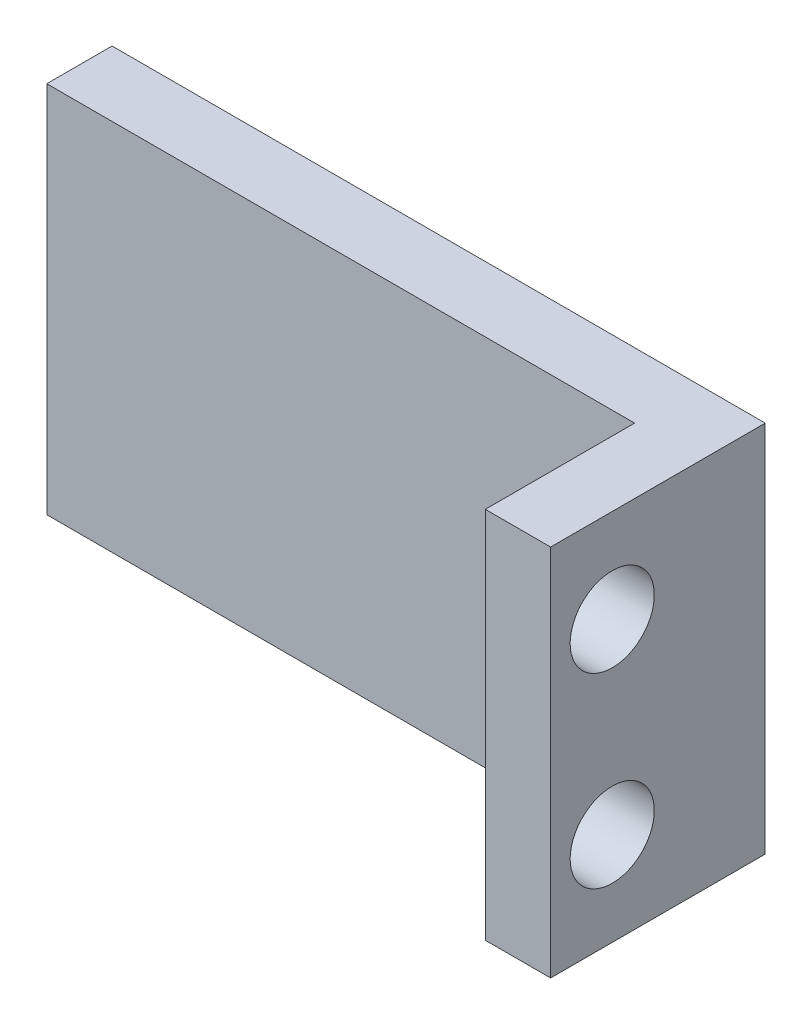
ISO-10303-21;
HEADER;
FILE_DESCRIPTION(('STEP AP214'),'2;1');
FILE_NAME('part.step','',(''),(''),'','','');
FILE_SCHEMA(('AUTOMOTIVE_DESIGN { 1 0 10303 214 1 1 1 1 }'));
ENDSEC;
DATA;
#1=APPLICATION_CONTEXT('core data for automotive mechanical design processes');
#2=APPLICATION_PROTOCOL_DEFINITION('international standard','automotive_design',2000,#1);
#3=PRODUCT_CONTEXT('',#1,'mechanical');
#4=PRODUCT('Part','Part','',(#3));
#5=PRODUCT_RELATED_PRODUCT_CATEGORY('part','',(#4));
#6=PRODUCT_DEFINITION_FORMATION('','',#4);
#7=PRODUCT_DEFINITION_CONTEXT('part definition',#1,'design');
#8=PRODUCT_DEFINITION('design','',#6,#7);
#9=PRODUCT_DEFINITION_SHAPE('','',#8);
#10=(LENGTH_UNIT() NAMED_UNIT(*) SI_UNIT(.MILLI.,.METRE.));
#11=(NAMED_UNIT(*) PLANE_ANGLE_UNIT() SI_UNIT($,.RADIAN.));
#12=(NAMED_UNIT(*) SI_UNIT($,.STERADIAN.) SOLID_ANGLE_UNIT());
#13=UNCERTAINTY_MEASURE_WITH_UNIT(LENGTH_MEASURE(1.E-05),#10,'distance_accuracy_value','');
#14=(GEOMETRIC_REPRESENTATION_CONTEXT(3) GLOBAL_UNCERTAINTY_ASSIGNED_CONTEXT((#13)) GLOBAL_UNIT_ASSIGNED_CONTEXT((#10,
#11,#12)) REPRESENTATION_CONTEXT('',''));
#15=CARTESIAN_POINT('',(0.,0.,0.));
#16=DIRECTION('',(0.,0.,1.));
#17=DIRECTION('',(1.,0.,0.));
#18=AXIS2_PLACEMENT_3D('',#15,#16,#17);
#19=CARTESIAN_POINT('',(-17.5,-10.,3.5));
#20=DIRECTION('',(1.,0.,0.));
#21=DIRECTION('',(0.,0.,-1.));
#22=AXIS2_PLACEMENT_3D('',#19,#20,#21);
#23=PLANE('',#22);
#24=DIRECTION('',(0.,-1.,0.));
#25=VECTOR('',#24,1.);
#26=CARTESIAN_POINT('',(-17.5,-10.,0.));
#27=LINE('',#26,#25);
#28=CARTESIAN_POINT('',(-17.5,10.,0.));
#29=VERTEX_POINT('',#28);
#30=CARTESIAN_POINT('',(-17.5,-10.,0.));
#31=VERTEX_POINT('',#30);
#32=EDGE_CURVE('E101',#29,#31,#27,.T.);
#33=ORIENTED_EDGE('',*,*,#32,.T.);
#34=DIRECTION('',(0.,0.,-1.));
#35=VECTOR('',#34,1.);
#36=CARTESIAN_POINT('',(-17.5,-10.,3.5));
#37=LINE('',#36,#35);
#38=CARTESIAN_POINT('',(-17.5,-10.,3.5));
#39=VERTEX_POINT('',#38);
#40=EDGE_CURVE('E11',#39,#31,#37,.T.);
#41=ORIENTED_EDGE('',*,*,#40,.F.);
#42=DIRECTION('',(0.,-1.,0.));
#43=VECTOR('',#42,1.);
#44=CARTESIAN_POINT('',(-17.5,-10.,3.5));
#45=LINE('',#44,#43);
#46=CARTESIAN_POINT('',(-17.5,10.,3.5));
#47=VERTEX_POINT('',#46);
#48=EDGE_CURVE('E95',#47,#39,#45,.T.);
#49=ORIENTED_EDGE('',*,*,#48,.F.);
#50=DIRECTION('',(0.,0.,-1.));
#51=VECTOR('',#50,1.);
#52=CARTESIAN_POINT('',(-17.5,10.,3.5));
#53=LINE('',#52,#51);
#54=EDGE_CURVE('E86',#47,#29,#53,.T.);
#55=ORIENTED_EDGE('',*,*,#54,.T.);
#56=EDGE_LOOP('',(#33,#41,#49,#55));
#57=FACE_BOUND('',#56,.T.);
#58=ADVANCED_FACE('F43',(#57),#23,.F.);
#59=CARTESIAN_POINT('',(17.5,-10.,3.5));
#60=DIRECTION('',(0.,1.,0.));
#61=DIRECTION('',(-1.,0.,0.));
#62=AXIS2_PLACEMENT_3D('',#59,#60,#61);
#63=PLANE('',#62);
#64=DIRECTION('',(1.,0.,0.));
#65=VECTOR('',#64,1.);
#66=CARTESIAN_POINT('',(17.5,-10.,0.));
#67=LINE('',#66,#65);
#68=CARTESIAN_POINT('',(17.5,-10.,0.));
#69=VERTEX_POINT('',#68);
#70=EDGE_CURVE('E105',#31,#69,#67,.T.);
#71=ORIENTED_EDGE('',*,*,#70,.T.);
#72=DIRECTION('',(0.,0.,-1.));
#73=VECTOR('',#72,1.);
#74=CARTESIAN_POINT('',(17.5,-10.,3.5));
#75=LINE('',#74,#73);
#76=CARTESIAN_POINT('',(17.5,-10.,11.5));
#77=VERTEX_POINT('',#76);
#78=EDGE_CURVE('E51',#77,#69,#75,.T.);
#79=ORIENTED_EDGE('',*,*,#78,.F.);
#80=DIRECTION('',(1.,0.,0.));
#81=VECTOR('',#80,1.);
#82=CARTESIAN_POINT('',(17.5,-10.,11.5));
#83=LINE('',#82,#81);
#84=CARTESIAN_POINT('',(14.,-10.,11.5));
#85=VERTEX_POINT('',#84);
#86=EDGE_CURVE('E135',#85,#77,#83,.T.);
#87=ORIENTED_EDGE('',*,*,#86,.F.);
#88=DIRECTION('',(0.,0.,-1.));
#89=VECTOR('',#88,1.);
#90=CARTESIAN_POINT('',(14.,-10.,11.5));
#91=LINE('',#90,#89);
#92=CARTESIAN_POINT('',(14.,-10.,3.5));
#93=VERTEX_POINT('',#92);
#94=EDGE_CURVE('E113',#85,#93,#91,.T.);
#95=ORIENTED_EDGE('',*,*,#94,.T.);
#96=DIRECTION('',(1.,0.,0.));
#97=VECTOR('',#96,1.);
#98=CARTESIAN_POINT('',(17.5,-10.,3.5));
#99=LINE('',#98,#97);
#100=EDGE_CURVE('E158',#39,#93,#99,.T.);
#101=ORIENTED_EDGE('',*,*,#100,.F.);
#102=ORIENTED_EDGE('',*,*,#40,.T.);
#103=EDGE_LOOP('',(#71,#79,#87,#95,#101,#102));
#104=FACE_BOUND('',#103,.T.);
#105=ADVANCED_FACE('F132',(#104),#63,.F.);
#106=CARTESIAN_POINT('',(17.5,-10.,3.5));
#107=DIRECTION('',(-1.,0.,0.));
#108=DIRECTION('',(0.,0.,1.));
#109=AXIS2_PLACEMENT_3D('',#106,#107,#108);
#110=PLANE('',#109);
#111=CARTESIAN_POINT('',(17.5,5.,8.2));
#112=DIRECTION('',(-1.,0.,0.));
#113=DIRECTION('',(0.,0.,1.));
#114=AXIS2_PLACEMENT_3D('',#111,#112,#113);
#115=CIRCLE('',#114,2.255);
#116=CARTESIAN_POINT('',(17.5,5.,10.455));
#117=VERTEX_POINT('',#116);
#118=EDGE_CURVE('E155',#117,#117,#115,.T.);
#119=ORIENTED_EDGE('',*,*,#118,.T.);
#120=EDGE_LOOP('',(#119));
#121=FACE_BOUND('',#120,.T.);
#122=CARTESIAN_POINT('',(17.5,-5.,8.19999999999999));
#123=DIRECTION('',(-1.,0.,0.));
#124=DIRECTION('',(0.,0.,1.));
#125=AXIS2_PLACEMENT_3D('',#122,#123,#124);
#126=CIRCLE('',#125,2.255);
#127=CARTESIAN_POINT('',(17.5,-5.,10.455));
#128=VERTEX_POINT('',#127);
#129=EDGE_CURVE('E177',#128,#128,#126,.T.);
#130=ORIENTED_EDGE('',*,*,#129,.T.);
#131=EDGE_LOOP('',(#130));
#132=FACE_BOUND('',#131,.T.);
#133=DIRECTION('',(0.,1.,0.));
#134=VECTOR('',#133,1.);
#135=CARTESIAN_POINT('',(17.5,-10.,0.));
#136=LINE('',#135,#134);
#137=CARTESIAN_POINT('',(17.5,10.,0.));
#138=VERTEX_POINT('',#137);
#139=EDGE_CURVE('E96',#69,#138,#136,.T.);
#140=ORIENTED_EDGE('',*,*,#139,.T.);
#141=DIRECTION('',(0.,0.,-1.));
#142=VECTOR('',#141,1.);
#143=CARTESIAN_POINT('',(17.5,10.,3.5));
#144=LINE('',#143,#142);
#145=CARTESIAN_POINT('',(17.5,10.,11.5));
#146=VERTEX_POINT('',#145);
#147=EDGE_CURVE('E90',#146,#138,#144,.T.);
#148=ORIENTED_EDGE('',*,*,#147,.F.);
#149=DIRECTION('',(0.,1.,0.));
#150=VECTOR('',#149,1.);
#151=CARTESIAN_POINT('',(17.5,-10.,11.5));
#152=LINE('',#151,#150);
#153=EDGE_CURVE('E128',#77,#146,#152,.T.);
#154=ORIENTED_EDGE('',*,*,#153,.F.);
#155=ORIENTED_EDGE('',*,*,#78,.T.);
#156=EDGE_LOOP('',(#140,#148,#154,#155));
#157=FACE_BOUND('',#156,.T.);
#158=ADVANCED_FACE('F126',(#121,#132,#157),#110,.F.);
#159=CARTESIAN_POINT('',(17.5,10.,3.5));
#160=DIRECTION('',(0.,-1.,0.));
#161=DIRECTION('',(1.,0.,0.));
#162=AXIS2_PLACEMENT_3D('',#159,#160,#161);
#163=PLANE('',#162);
#164=DIRECTION('',(-1.,0.,0.));
#165=VECTOR('',#164,1.);
#166=CARTESIAN_POINT('',(17.5,10.,0.));
#167=LINE('',#166,#165);
#168=EDGE_CURVE('E83',#138,#29,#167,.T.);
#169=ORIENTED_EDGE('',*,*,#168,.T.);
#170=ORIENTED_EDGE('',*,*,#54,.F.);
#171=DIRECTION('',(-1.,0.,0.));
#172=VECTOR('',#171,1.);
#173=CARTESIAN_POINT('',(17.5,10.,3.5));
#174=LINE('',#173,#172);
#175=CARTESIAN_POINT('',(14.,10.,3.5));
#176=VERTEX_POINT('',#175);
#177=EDGE_CURVE('E63',#176,#47,#174,.T.);
#178=ORIENTED_EDGE('',*,*,#177,.F.);
#179=DIRECTION('',(0.,0.,-1.));
#180=VECTOR('',#179,1.);
#181=CARTESIAN_POINT('',(14.,10.,11.5));
#182=LINE('',#181,#180);
#183=CARTESIAN_POINT('',(14.,10.,11.5));
#184=VERTEX_POINT('',#183);
#185=EDGE_CURVE('E107',#184,#176,#182,.T.);
#186=ORIENTED_EDGE('',*,*,#185,.F.);
#187=DIRECTION('',(-1.,0.,0.));
#188=VECTOR('',#187,1.);
#189=CARTESIAN_POINT('',(17.5,10.,11.5));
#190=LINE('',#189,#188);
#191=EDGE_CURVE('E150',#146,#184,#190,.T.);
#192=ORIENTED_EDGE('',*,*,#191,.F.);
#193=ORIENTED_EDGE('',*,*,#147,.T.);
#194=EDGE_LOOP('',(#169,#170,#178,#186,#192,#193));
#195=FACE_BOUND('',#194,.T.);
#196=ADVANCED_FACE('F85',(#195),#163,.F.);
#197=CARTESIAN_POINT('',(0.,0.,3.5));
#198=DIRECTION('',(0.,0.,1.));
#199=DIRECTION('',(1.,0.,0.));
#200=AXIS2_PLACEMENT_3D('',#197,#198,#199);
#201=PLANE('',#200);
#202=DIRECTION('',(0.,-1.,0.));
#203=VECTOR('',#202,1.);
#204=CARTESIAN_POINT('',(14.,-10.,3.5));
#205=LINE('',#204,#203);
#206=EDGE_CURVE('E58',#176,#93,#205,.T.);
#207=ORIENTED_EDGE('',*,*,#206,.F.);
#208=ORIENTED_EDGE('',*,*,#177,.T.);
#209=ORIENTED_EDGE('',*,*,#48,.T.);
#210=ORIENTED_EDGE('',*,*,#100,.T.);
#211=EDGE_LOOP('',(#207,#208,#209,#210));
#212=FACE_BOUND('',#211,.T.);
#213=ADVANCED_FACE('F162',(#212),#201,.T.);
#214=CARTESIAN_POINT('',(0.,0.,0.));
#215=DIRECTION('',(0.,0.,1.));
#216=DIRECTION('',(1.,0.,0.));
#217=AXIS2_PLACEMENT_3D('',#214,#215,#216);
#218=PLANE('',#217);
#219=ORIENTED_EDGE('',*,*,#32,.F.);
#220=ORIENTED_EDGE('',*,*,#168,.F.);
#221=ORIENTED_EDGE('',*,*,#139,.F.);
#222=ORIENTED_EDGE('',*,*,#70,.F.);
#223=EDGE_LOOP('',(#219,#220,#221,#222));
#224=FACE_BOUND('',#223,.T.);
#225=ADVANCED_FACE('F104',(#224),#218,.F.);
#226=CARTESIAN_POINT('',(14.,-10.,11.5));
#227=DIRECTION('',(1.,0.,0.));
#228=DIRECTION('',(0.,0.,-1.));
#229=AXIS2_PLACEMENT_3D('',#226,#227,#228);
#230=PLANE('',#229);
#231=CARTESIAN_POINT('',(14.,5.,8.2));
#232=DIRECTION('',(-1.,0.,0.));
#233=DIRECTION('',(0.,0.,1.));
#234=AXIS2_PLACEMENT_3D('',#231,#232,#233);
#235=CIRCLE('',#234,2.255);
#236=CARTESIAN_POINT('',(14.,5.,10.455));
#237=VERTEX_POINT('',#236);
#238=EDGE_CURVE('E181',#237,#237,#235,.T.);
#239=ORIENTED_EDGE('',*,*,#238,.F.);
#240=EDGE_LOOP('',(#239));
#241=FACE_BOUND('',#240,.T.);
#242=CARTESIAN_POINT('',(14.,-5.,8.19999999999999));
#243=DIRECTION('',(-1.,0.,0.));
#244=DIRECTION('',(0.,0.,-1.));
#245=AXIS2_PLACEMENT_3D('',#242,#243,#244);
#246=CIRCLE('',#245,2.255);
#247=CARTESIAN_POINT('',(14.,-5.,5.94499999999999));
#248=VERTEX_POINT('',#247);
#249=EDGE_CURVE('E182',#248,#248,#246,.T.);
#250=ORIENTED_EDGE('',*,*,#249,.F.);
#251=EDGE_LOOP('',(#250));
#252=FACE_BOUND('',#251,.T.);
#253=ORIENTED_EDGE('',*,*,#206,.T.);
#254=ORIENTED_EDGE('',*,*,#94,.F.);
#255=DIRECTION('',(0.,-1.,0.));
#256=VECTOR('',#255,1.);
#257=CARTESIAN_POINT('',(14.,-10.,11.5));
#258=LINE('',#257,#256);
#259=EDGE_CURVE('E143',#184,#85,#258,.T.);
#260=ORIENTED_EDGE('',*,*,#259,.F.);
#261=ORIENTED_EDGE('',*,*,#185,.T.);
#262=EDGE_LOOP('',(#253,#254,#260,#261));
#263=FACE_BOUND('',#262,.T.);
#264=ADVANCED_FACE('F164',(#241,#252,#263),#230,.F.);
#265=CARTESIAN_POINT('',(0.,0.,11.5));
#266=DIRECTION('',(0.,0.,1.));
#267=DIRECTION('',(1.,0.,0.));
#268=AXIS2_PLACEMENT_3D('',#265,#266,#267);
#269=PLANE('',#268);
#270=ORIENTED_EDGE('',*,*,#153,.T.);
#271=ORIENTED_EDGE('',*,*,#191,.T.);
#272=ORIENTED_EDGE('',*,*,#259,.T.);
#273=ORIENTED_EDGE('',*,*,#86,.T.);
#274=EDGE_LOOP('',(#270,#271,#272,#273));
#275=FACE_BOUND('',#274,.T.);
#276=ADVANCED_FACE('F139',(#275),#269,.T.);
#277=CARTESIAN_POINT('',(22.,-5.,8.19999999999999));
#278=DIRECTION('',(-1.,0.,0.));
#279=DIRECTION('',(0.,0.,1.));
#280=AXIS2_PLACEMENT_3D('',#277,#278,#279);
#281=CYLINDRICAL_SURFACE('',#280,2.255);
#282=ORIENTED_EDGE('',*,*,#249,.T.);
#283=EDGE_LOOP('',(#282));
#284=FACE_BOUND('',#283,.T.);
#285=ORIENTED_EDGE('',*,*,#129,.F.);
#286=EDGE_LOOP('',(#285));
#287=FACE_BOUND('',#286,.T.);
#288=ADVANCED_FACE('F198',(#284,#287),#281,.F.);
#289=CARTESIAN_POINT('',(22.,5.,8.2));
#290=DIRECTION('',(-1.,0.,0.));
#291=DIRECTION('',(0.,0.,1.));
#292=AXIS2_PLACEMENT_3D('',#289,#290,#291);
#293=CYLINDRICAL_SURFACE('',#292,2.255);
#294=ORIENTED_EDGE('',*,*,#238,.T.);
#295=EDGE_LOOP('',(#294));
#296=FACE_BOUND('',#295,.T.);
#297=ORIENTED_EDGE('',*,*,#118,.F.);
#298=EDGE_LOOP('',(#297));
#299=FACE_BOUND('',#298,.T.);
#300=ADVANCED_FACE('F190',(#296,#299),#293,.F.);
#301=CLOSED_SHELL('',(#58,#105,#158,#196,#213,#225,#264,#276,#288,#300));
#302=MANIFOLD_SOLID_BREP('B2',#301);
#303=ADVANCED_BREP_SHAPE_REPRESENTATION('',(#18,#302),#14);
#304=SHAPE_DEFINITION_REPRESENTATION(#9,#303);
ENDSEC;
END-ISO-10303-21;
